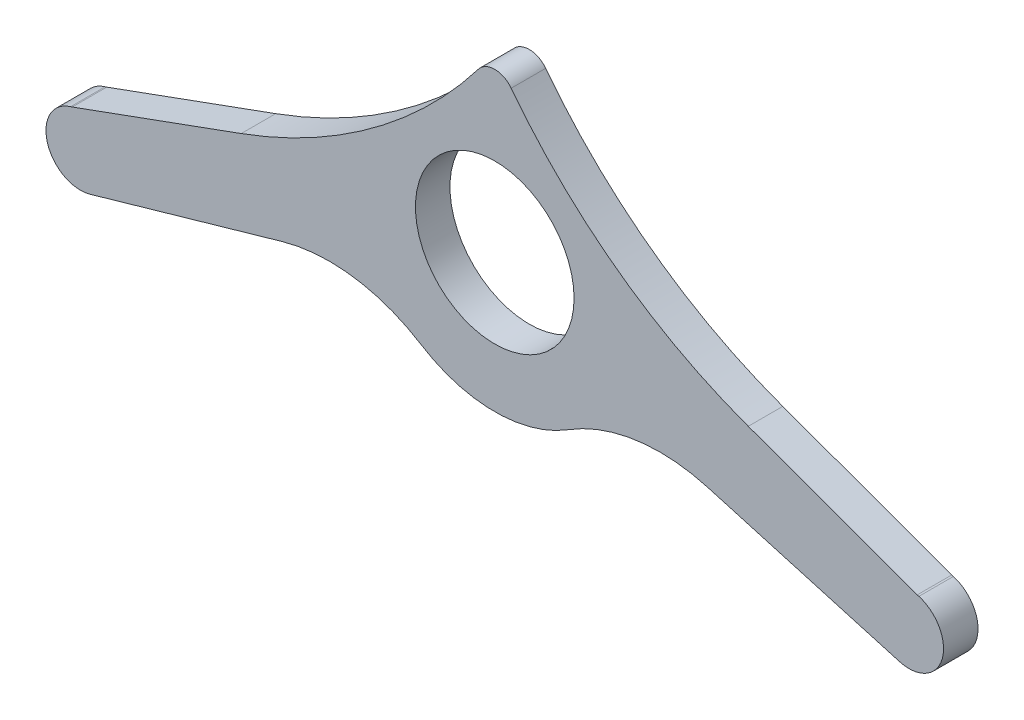
ISO-10303-21;
HEADER;
FILE_DESCRIPTION(('STEP AP214'),'2;1');
FILE_NAME('part.step','',(''),(''),'','','');
FILE_SCHEMA(('AUTOMOTIVE_DESIGN { 1 0 10303 214 1 1 1 1 }'));
ENDSEC;
DATA;
#1=APPLICATION_CONTEXT('core data for automotive mechanical design processes');
#2=APPLICATION_PROTOCOL_DEFINITION('international standard','automotive_design',2000,#1);
#3=PRODUCT_CONTEXT('',#1,'mechanical');
#4=PRODUCT('Part','Part','',(#3));
#5=PRODUCT_RELATED_PRODUCT_CATEGORY('part','',(#4));
#6=PRODUCT_DEFINITION_FORMATION('','',#4);
#7=PRODUCT_DEFINITION_CONTEXT('part definition',#1,'design');
#8=PRODUCT_DEFINITION('design','',#6,#7);
#9=PRODUCT_DEFINITION_SHAPE('','',#8);
#10=(LENGTH_UNIT() NAMED_UNIT(*) SI_UNIT(.MILLI.,.METRE.));
#11=(NAMED_UNIT(*) PLANE_ANGLE_UNIT() SI_UNIT($,.RADIAN.));
#12=(NAMED_UNIT(*) SI_UNIT($,.STERADIAN.) SOLID_ANGLE_UNIT());
#13=UNCERTAINTY_MEASURE_WITH_UNIT(LENGTH_MEASURE(1.E-05),#10,'distance_accuracy_value','');
#14=(GEOMETRIC_REPRESENTATION_CONTEXT(3) GLOBAL_UNCERTAINTY_ASSIGNED_CONTEXT((#13)) GLOBAL_UNIT_ASSIGNED_CONTEXT((#10,
#11,#12)) REPRESENTATION_CONTEXT('',''));
#15=CARTESIAN_POINT('',(0.,0.,0.));
#16=DIRECTION('',(0.,0.,1.));
#17=DIRECTION('',(1.,0.,0.));
#18=AXIS2_PLACEMENT_3D('',#15,#16,#17);
#19=CARTESIAN_POINT('',(0.,0.,5.));
#20=DIRECTION('',(0.,0.,-1.));
#21=DIRECTION('',(-1.,0.,0.));
#22=AXIS2_PLACEMENT_3D('',#19,#20,#21);
#23=CYLINDRICAL_SURFACE('',#22,11.5);
#24=CARTESIAN_POINT('',(0.,0.,5.));
#25=DIRECTION('',(0.,0.,1.));
#26=DIRECTION('',(1.,0.,0.));
#27=AXIS2_PLACEMENT_3D('',#24,#25,#26);
#28=CIRCLE('',#27,11.5);
#29=CARTESIAN_POINT('',(11.5,0.,5.));
#30=VERTEX_POINT('',#29);
#31=EDGE_CURVE('E220',#30,#30,#28,.T.);
#32=ORIENTED_EDGE('',*,*,#31,.T.);
#33=EDGE_LOOP('',(#32));
#34=FACE_BOUND('',#33,.T.);
#35=CARTESIAN_POINT('',(0.,0.,0.));
#36=DIRECTION('',(0.,0.,1.));
#37=DIRECTION('',(1.,0.,0.));
#38=AXIS2_PLACEMENT_3D('',#35,#36,#37);
#39=CIRCLE('',#38,11.5);
#40=CARTESIAN_POINT('',(11.5,0.,0.));
#41=VERTEX_POINT('',#40);
#42=EDGE_CURVE('E260',#41,#41,#39,.T.);
#43=ORIENTED_EDGE('',*,*,#42,.F.);
#44=EDGE_LOOP('',(#43));
#45=FACE_BOUND('',#44,.T.);
#46=ADVANCED_FACE('F86',(#34,#45),#23,.F.);
#47=CARTESIAN_POINT('',(62.7335795182697,67.9127360594033,5.));
#48=DIRECTION('',(0.,0.,-1.));
#49=DIRECTION('',(-1.,0.,0.));
#50=AXIS2_PLACEMENT_3D('',#47,#48,#49);
#51=CYLINDRICAL_SURFACE('',#50,75.9375213436114);
#52=CARTESIAN_POINT('',(62.7335795182697,67.9127360594033,0.));
#53=DIRECTION('',(0.,0.,1.));
#54=DIRECTION('',(1.,0.,0.));
#55=AXIS2_PLACEMENT_3D('',#52,#53,#54);
#56=CIRCLE('',#55,75.9375213436114);
#57=CARTESIAN_POINT('',(36.7614175845321,-3.44519238796093,0.));
#58=VERTEX_POINT('',#57);
#59=CARTESIAN_POINT('',(2.38417339880207,21.8209110918561,0.));
#60=VERTEX_POINT('',#59);
#61=EDGE_CURVE('E227',#58,#60,#56,.F.);
#62=ORIENTED_EDGE('',*,*,#61,.T.);
#63=DIRECTION('',(0.,0.,-1.));
#64=VECTOR('',#63,1.);
#65=CARTESIAN_POINT('',(2.38417339880207,21.8209110918561,5.));
#66=LINE('',#65,#64);
#67=CARTESIAN_POINT('',(2.38417339880207,21.8209110918561,5.));
#68=VERTEX_POINT('',#67);
#69=EDGE_CURVE('E98',#68,#60,#66,.T.);
#70=ORIENTED_EDGE('',*,*,#69,.F.);
#71=CARTESIAN_POINT('',(62.7335795182697,67.9127360594033,5.));
#72=DIRECTION('',(0.,0.,1.));
#73=DIRECTION('',(1.,0.,0.));
#74=AXIS2_PLACEMENT_3D('',#71,#72,#73);
#75=CIRCLE('',#74,75.9375213436114);
#76=CARTESIAN_POINT('',(36.7614175845321,-3.44519238796093,5.));
#77=VERTEX_POINT('',#76);
#78=EDGE_CURVE('E164',#77,#68,#75,.F.);
#79=ORIENTED_EDGE('',*,*,#78,.F.);
#80=DIRECTION('',(0.,0.,-1.));
#81=VECTOR('',#80,1.);
#82=CARTESIAN_POINT('',(36.7614175845321,-3.44519238796093,5.));
#83=LINE('',#82,#81);
#84=EDGE_CURVE('E12',#77,#58,#83,.T.);
#85=ORIENTED_EDGE('',*,*,#84,.T.);
#86=EDGE_LOOP('',(#62,#70,#79,#85));
#87=FACE_BOUND('',#86,.T.);
#88=ADVANCED_FACE('F344',(#87),#51,.F.);
#89=CARTESIAN_POINT('',(0.,20.,5.));
#90=DIRECTION('',(0.,0.,-1.));
#91=DIRECTION('',(-1.,0.,0.));
#92=AXIS2_PLACEMENT_3D('',#89,#90,#91);
#93=CYLINDRICAL_SURFACE('',#92,3.);
#94=CARTESIAN_POINT('',(0.,20.,0.));
#95=DIRECTION('',(0.,0.,1.));
#96=DIRECTION('',(1.,0.,0.));
#97=AXIS2_PLACEMENT_3D('',#94,#95,#96);
#98=CIRCLE('',#97,3.);
#99=CARTESIAN_POINT('',(-2.38417339880207,21.8209110918561,0.));
#100=VERTEX_POINT('',#99);
#101=EDGE_CURVE('E226',#60,#100,#98,.T.);
#102=ORIENTED_EDGE('',*,*,#101,.T.);
#103=DIRECTION('',(0.,0.,-1.));
#104=VECTOR('',#103,1.);
#105=CARTESIAN_POINT('',(-2.38417339880207,21.8209110918561,5.));
#106=LINE('',#105,#104);
#107=CARTESIAN_POINT('',(-2.38417339880207,21.8209110918561,5.));
#108=VERTEX_POINT('',#107);
#109=EDGE_CURVE('E278',#108,#100,#106,.T.);
#110=ORIENTED_EDGE('',*,*,#109,.F.);
#111=CARTESIAN_POINT('',(0.,20.,5.));
#112=DIRECTION('',(0.,0.,1.));
#113=DIRECTION('',(1.,0.,0.));
#114=AXIS2_PLACEMENT_3D('',#111,#112,#113);
#115=CIRCLE('',#114,3.);
#116=EDGE_CURVE('E290',#68,#108,#115,.T.);
#117=ORIENTED_EDGE('',*,*,#116,.F.);
#118=ORIENTED_EDGE('',*,*,#69,.T.);
#119=EDGE_LOOP('',(#102,#110,#117,#118));
#120=FACE_BOUND('',#119,.T.);
#121=ADVANCED_FACE('F289',(#120),#93,.T.);
#122=CARTESIAN_POINT('',(-62.7335795182697,67.9127360594033,5.));
#123=DIRECTION('',(0.,0.,-1.));
#124=DIRECTION('',(-1.,0.,0.));
#125=AXIS2_PLACEMENT_3D('',#122,#123,#124);
#126=CYLINDRICAL_SURFACE('',#125,75.9375213436114);
#127=CARTESIAN_POINT('',(-62.7335795182697,67.9127360594033,0.));
#128=DIRECTION('',(0.,0.,1.));
#129=DIRECTION('',(1.,0.,0.));
#130=AXIS2_PLACEMENT_3D('',#127,#128,#129);
#131=CIRCLE('',#130,75.9375213436114);
#132=CARTESIAN_POINT('',(-36.7614175845321,-3.44519238796093,0.));
#133=VERTEX_POINT('',#132);
#134=EDGE_CURVE('E235',#133,#100,#131,.T.);
#135=ORIENTED_EDGE('',*,*,#134,.F.);
#136=DIRECTION('',(0.,0.,-1.));
#137=VECTOR('',#136,1.);
#138=CARTESIAN_POINT('',(-36.7614175845321,-3.44519238796093,5.));
#139=LINE('',#138,#137);
#140=CARTESIAN_POINT('',(-36.7614175845321,-3.44519238796093,5.));
#141=VERTEX_POINT('',#140);
#142=EDGE_CURVE('E279',#141,#133,#139,.T.);
#143=ORIENTED_EDGE('',*,*,#142,.F.);
#144=CARTESIAN_POINT('',(-62.7335795182697,67.9127360594033,5.));
#145=DIRECTION('',(0.,0.,1.));
#146=DIRECTION('',(1.,0.,0.));
#147=AXIS2_PLACEMENT_3D('',#144,#145,#146);
#148=CIRCLE('',#147,75.9375213436114);
#149=EDGE_CURVE('E300',#141,#108,#148,.T.);
#150=ORIENTED_EDGE('',*,*,#149,.T.);
#151=ORIENTED_EDGE('',*,*,#109,.T.);
#152=EDGE_LOOP('',(#135,#143,#150,#151));
#153=FACE_BOUND('',#152,.T.);
#154=ADVANCED_FACE('F298',(#153),#126,.F.);
#155=CARTESIAN_POINT('',(-3.19300547137855,8.77271043280779,5.));
#156=DIRECTION('',(-0.342020143325663,0.93969262078591,0.));
#157=DIRECTION('',(-0.93969262078591,-0.342020143325663,0.));
#158=AXIS2_PLACEMENT_3D('',#155,#156,#157);
#159=PLANE('',#158);
#160=DIRECTION('',(0.939692620785911,0.342020143325663,0.));
#161=VECTOR('',#160,1.);
#162=CARTESIAN_POINT('',(-3.19300547137855,8.77271043280779,0.));
#163=LINE('',#162,#161);
#164=CARTESIAN_POINT('',(-61.2649014678834,-12.3637311573222,0.));
#165=VERTEX_POINT('',#164);
#166=EDGE_CURVE('E237',#165,#133,#163,.T.);
#167=ORIENTED_EDGE('',*,*,#166,.F.);
#168=DIRECTION('',(0.,0.,-1.));
#169=VECTOR('',#168,1.);
#170=CARTESIAN_POINT('',(-61.2649014678834,-12.3637311573222,5.));
#171=LINE('',#170,#169);
#172=CARTESIAN_POINT('',(-61.2649014678834,-12.3637311573222,5.));
#173=VERTEX_POINT('',#172);
#174=EDGE_CURVE('E277',#173,#165,#171,.T.);
#175=ORIENTED_EDGE('',*,*,#174,.F.);
#176=DIRECTION('',(0.939692620785911,0.342020143325663,0.));
#177=VECTOR('',#176,1.);
#178=CARTESIAN_POINT('',(-3.19300547137855,8.77271043280779,5.));
#179=LINE('',#178,#177);
#180=EDGE_CURVE('E301',#173,#141,#179,.T.);
#181=ORIENTED_EDGE('',*,*,#180,.T.);
#182=ORIENTED_EDGE('',*,*,#142,.T.);
#183=EDGE_LOOP('',(#167,#175,#181,#182));
#184=FACE_BOUND('',#183,.T.);
#185=ADVANCED_FACE('F512',(#184),#159,.T.);
#186=CARTESIAN_POINT('',(-1.59135260480715,5.35837356331416,5.));
#187=DIRECTION('',(-0.284694541752313,0.958618285813723,0.));
#188=DIRECTION('',(-0.958618285813723,-0.284694541752313,0.));
#189=AXIS2_PLACEMENT_3D('',#186,#187,#188);
#190=PLANE('',#189);
#191=DIRECTION('',(0.958618285813723,0.284694541752313,0.));
#192=VECTOR('',#191,1.);
#193=CARTESIAN_POINT('',(-1.59135260480715,5.35837356331416,0.));
#194=LINE('',#193,#192);
#195=CARTESIAN_POINT('',(-61.5023287049065,-12.4342433094939,0.));
#196=VERTEX_POINT('',#195);
#197=EDGE_CURVE('E239',#196,#165,#194,.T.);
#198=ORIENTED_EDGE('',*,*,#197,.F.);
#199=DIRECTION('',(0.,0.,-1.));
#200=VECTOR('',#199,1.);
#201=CARTESIAN_POINT('',(-61.5023287049065,-12.4342433094939,5.));
#202=LINE('',#201,#200);
#203=CARTESIAN_POINT('',(-61.5023287049065,-12.4342433094939,5.));
#204=VERTEX_POINT('',#203);
#205=EDGE_CURVE('E273',#204,#196,#202,.T.);
#206=ORIENTED_EDGE('',*,*,#205,.F.);
#207=DIRECTION('',(0.958618285813723,0.284694541752313,0.));
#208=VECTOR('',#207,1.);
#209=CARTESIAN_POINT('',(-1.59135260480715,5.35837356331416,5.));
#210=LINE('',#209,#208);
#211=EDGE_CURVE('E303',#204,#173,#210,.T.);
#212=ORIENTED_EDGE('',*,*,#211,.T.);
#213=ORIENTED_EDGE('',*,*,#174,.T.);
#214=EDGE_LOOP('',(#198,#206,#212,#213));
#215=FACE_BOUND('',#214,.T.);
#216=ADVANCED_FACE('F504',(#215),#190,.T.);
#217=CARTESIAN_POINT('',(-60.0788559961449,-17.2273347385625,5.));
#218=DIRECTION('',(0.,0.,-1.));
#219=DIRECTION('',(-1.,0.,0.));
#220=AXIS2_PLACEMENT_3D('',#217,#218,#219);
#221=CYLINDRICAL_SURFACE('',#220,5.);
#222=CARTESIAN_POINT('',(-60.0788559961449,-17.2273347385625,0.));
#223=DIRECTION('',(0.,0.,1.));
#224=DIRECTION('',(1.,0.,0.));
#225=AXIS2_PLACEMENT_3D('',#222,#223,#224);
#226=CIRCLE('',#225,5.);
#227=CARTESIAN_POINT('',(-58.7006692170599,-22.0336432182541,0.));
#228=VERTEX_POINT('',#227);
#229=EDGE_CURVE('E244',#228,#196,#226,.F.);
#230=ORIENTED_EDGE('',*,*,#229,.F.);
#231=DIRECTION('',(0.,0.,-1.));
#232=VECTOR('',#231,1.);
#233=CARTESIAN_POINT('',(-58.7006692170599,-22.0336432182541,5.));
#234=LINE('',#233,#232);
#235=CARTESIAN_POINT('',(-58.7006692170599,-22.0336432182541,5.));
#236=VERTEX_POINT('',#235);
#237=EDGE_CURVE('E275',#236,#228,#234,.T.);
#238=ORIENTED_EDGE('',*,*,#237,.F.);
#239=CARTESIAN_POINT('',(-60.0788559961449,-17.2273347385625,5.));
#240=DIRECTION('',(0.,0.,1.));
#241=DIRECTION('',(1.,0.,0.));
#242=AXIS2_PLACEMENT_3D('',#239,#240,#241);
#243=CIRCLE('',#242,5.);
#244=EDGE_CURVE('E313',#236,#204,#243,.F.);
#245=ORIENTED_EDGE('',*,*,#244,.T.);
#246=ORIENTED_EDGE('',*,*,#205,.T.);
#247=EDGE_LOOP('',(#230,#238,#245,#246));
#248=FACE_BOUND('',#247,.T.);
#249=ADVANCED_FACE('F495',(#248),#221,.T.);
#250=CARTESIAN_POINT('',(1.37818677908509,-4.80630847969204,5.));
#251=DIRECTION('',(-0.275637355816993,0.961261695938321,0.));
#252=DIRECTION('',(-0.961261695938321,-0.275637355816993,0.));
#253=AXIS2_PLACEMENT_3D('',#250,#251,#252);
#254=PLANE('',#253);
#255=DIRECTION('',(0.961261695938321,0.275637355816993,0.));
#256=VECTOR('',#255,1.);
#257=CARTESIAN_POINT('',(1.37818677908509,-4.80630847969204,0.));
#258=LINE('',#257,#256);
#259=CARTESIAN_POINT('',(-30.8635106651872,-14.0514664508682,0.));
#260=VERTEX_POINT('',#259);
#261=EDGE_CURVE('E241',#228,#260,#258,.T.);
#262=ORIENTED_EDGE('',*,*,#261,.T.);
#263=DIRECTION('',(0.,0.,-1.));
#264=VECTOR('',#263,1.);
#265=CARTESIAN_POINT('',(-30.8635106651872,-14.0514664508682,5.));
#266=LINE('',#265,#264);
#267=CARTESIAN_POINT('',(-30.8635106651872,-14.0514664508682,5.));
#268=VERTEX_POINT('',#267);
#269=EDGE_CURVE('E267',#268,#260,#266,.T.);
#270=ORIENTED_EDGE('',*,*,#269,.F.);
#271=DIRECTION('',(0.961261695938321,0.275637355816993,0.));
#272=VECTOR('',#271,1.);
#273=CARTESIAN_POINT('',(1.37818677908509,-4.80630847969204,5.));
#274=LINE('',#273,#272);
#275=EDGE_CURVE('E314',#236,#268,#274,.T.);
#276=ORIENTED_EDGE('',*,*,#275,.F.);
#277=ORIENTED_EDGE('',*,*,#237,.T.);
#278=EDGE_LOOP('',(#262,#270,#276,#277));
#279=FACE_BOUND('',#278,.T.);
#280=ADVANCED_FACE('F485',(#279),#254,.F.);
#281=CARTESIAN_POINT('',(-23.9725767697622,-38.0830088493262,5.));
#282=DIRECTION('',(0.,0.,-1.));
#283=DIRECTION('',(-1.,0.,0.));
#284=AXIS2_PLACEMENT_3D('',#281,#282,#283);
#285=CYLINDRICAL_SURFACE('',#284,25.);
#286=CARTESIAN_POINT('',(-23.9725767697622,-38.0830088493262,0.));
#287=DIRECTION('',(0.,0.,1.));
#288=DIRECTION('',(1.,0.,0.));
#289=AXIS2_PLACEMENT_3D('',#286,#287,#288);
#290=CIRCLE('',#289,25.);
#291=CARTESIAN_POINT('',(-10.6544785643388,-16.9257817108117,0.));
#292=VERTEX_POINT('',#291);
#293=EDGE_CURVE('E246',#260,#292,#290,.F.);
#294=ORIENTED_EDGE('',*,*,#293,.T.);
#295=DIRECTION('',(0.,0.,-1.));
#296=VECTOR('',#295,1.);
#297=CARTESIAN_POINT('',(-10.6544785643388,-16.9257817108117,5.));
#298=LINE('',#297,#296);
#299=CARTESIAN_POINT('',(-10.6544785643388,-16.9257817108117,5.));
#300=VERTEX_POINT('',#299);
#301=EDGE_CURVE('E266',#300,#292,#298,.T.);
#302=ORIENTED_EDGE('',*,*,#301,.F.);
#303=CARTESIAN_POINT('',(-23.9725767697622,-38.0830088493262,5.));
#304=DIRECTION('',(0.,0.,1.));
#305=DIRECTION('',(1.,0.,0.));
#306=AXIS2_PLACEMENT_3D('',#303,#304,#305);
#307=CIRCLE('',#306,25.);
#308=EDGE_CURVE('E316',#268,#300,#307,.F.);
#309=ORIENTED_EDGE('',*,*,#308,.F.);
#310=ORIENTED_EDGE('',*,*,#269,.T.);
#311=EDGE_LOOP('',(#294,#302,#309,#310));
#312=FACE_BOUND('',#311,.T.);
#313=ADVANCED_FACE('F471',(#312),#285,.F.);
#314=CARTESIAN_POINT('',(0.,0.,5.));
#315=DIRECTION('',(0.,0.,-1.));
#316=DIRECTION('',(-1.,0.,0.));
#317=AXIS2_PLACEMENT_3D('',#314,#315,#316);
#318=CYLINDRICAL_SURFACE('',#317,20.);
#319=CARTESIAN_POINT('',(0.,0.,0.));
#320=DIRECTION('',(0.,0.,1.));
#321=DIRECTION('',(1.,0.,0.));
#322=AXIS2_PLACEMENT_3D('',#319,#320,#321);
#323=CIRCLE('',#322,20.);
#324=CARTESIAN_POINT('',(10.6544785643388,-16.9257817108117,0.));
#325=VERTEX_POINT('',#324);
#326=EDGE_CURVE('E248',#292,#325,#323,.T.);
#327=ORIENTED_EDGE('',*,*,#326,.T.);
#328=DIRECTION('',(0.,0.,-1.));
#329=VECTOR('',#328,1.);
#330=CARTESIAN_POINT('',(10.6544785643388,-16.9257817108117,5.));
#331=LINE('',#330,#329);
#332=CARTESIAN_POINT('',(10.6544785643388,-16.9257817108117,5.));
#333=VERTEX_POINT('',#332);
#334=EDGE_CURVE('E262',#333,#325,#331,.T.);
#335=ORIENTED_EDGE('',*,*,#334,.F.);
#336=CARTESIAN_POINT('',(0.,0.,5.));
#337=DIRECTION('',(0.,0.,1.));
#338=DIRECTION('',(1.,0.,0.));
#339=AXIS2_PLACEMENT_3D('',#336,#337,#338);
#340=CIRCLE('',#339,20.);
#341=EDGE_CURVE('E218',#300,#333,#340,.T.);
#342=ORIENTED_EDGE('',*,*,#341,.F.);
#343=ORIENTED_EDGE('',*,*,#301,.T.);
#344=EDGE_LOOP('',(#327,#335,#342,#343));
#345=FACE_BOUND('',#344,.T.);
#346=ADVANCED_FACE('F325',(#345),#318,.T.);
#347=CARTESIAN_POINT('',(23.9725767697622,-38.0830088493262,5.));
#348=DIRECTION('',(0.,0.,-1.));
#349=DIRECTION('',(-1.,0.,0.));
#350=AXIS2_PLACEMENT_3D('',#347,#348,#349);
#351=CYLINDRICAL_SURFACE('',#350,25.);
#352=CARTESIAN_POINT('',(23.9725767697622,-38.0830088493262,0.));
#353=DIRECTION('',(0.,0.,1.));
#354=DIRECTION('',(1.,0.,0.));
#355=AXIS2_PLACEMENT_3D('',#352,#353,#354);
#356=CIRCLE('',#355,25.);
#357=CARTESIAN_POINT('',(30.8635106651872,-14.0514664508682,0.));
#358=VERTEX_POINT('',#357);
#359=EDGE_CURVE('E252',#358,#325,#356,.T.);
#360=ORIENTED_EDGE('',*,*,#359,.F.);
#361=DIRECTION('',(0.,0.,-1.));
#362=VECTOR('',#361,1.);
#363=CARTESIAN_POINT('',(30.8635106651872,-14.0514664508682,5.));
#364=LINE('',#363,#362);
#365=CARTESIAN_POINT('',(30.8635106651872,-14.0514664508682,5.));
#366=VERTEX_POINT('',#365);
#367=EDGE_CURVE('E210',#366,#358,#364,.T.);
#368=ORIENTED_EDGE('',*,*,#367,.F.);
#369=CARTESIAN_POINT('',(23.9725767697622,-38.0830088493262,5.));
#370=DIRECTION('',(0.,0.,1.));
#371=DIRECTION('',(1.,0.,0.));
#372=AXIS2_PLACEMENT_3D('',#369,#370,#371);
#373=CIRCLE('',#372,25.);
#374=EDGE_CURVE('E214',#366,#333,#373,.T.);
#375=ORIENTED_EDGE('',*,*,#374,.T.);
#376=ORIENTED_EDGE('',*,*,#334,.T.);
#377=EDGE_LOOP('',(#360,#368,#375,#376));
#378=FACE_BOUND('',#377,.T.);
#379=ADVANCED_FACE('F326',(#378),#351,.F.);
#380=CARTESIAN_POINT('',(-1.378186779085,-4.8063084796916,5.));
#381=DIRECTION('',(-0.275637355817,-0.961261695938319,0.));
#382=DIRECTION('',(0.961261695938319,-0.275637355817,0.));
#383=AXIS2_PLACEMENT_3D('',#380,#381,#382);
#384=PLANE('',#383);
#385=DIRECTION('',(-0.961261695938319,0.275637355817,0.));
#386=VECTOR('',#385,1.);
#387=CARTESIAN_POINT('',(-1.378186779085,-4.8063084796916,0.));
#388=LINE('',#387,#386);
#389=CARTESIAN_POINT('',(58.7006692170599,-22.0336432182541,0.));
#390=VERTEX_POINT('',#389);
#391=EDGE_CURVE('E204',#390,#358,#388,.T.);
#392=ORIENTED_EDGE('',*,*,#391,.F.);
#393=DIRECTION('',(0.,0.,-1.));
#394=VECTOR('',#393,1.);
#395=CARTESIAN_POINT('',(58.7006692170599,-22.0336432182541,5.));
#396=LINE('',#395,#394);
#397=CARTESIAN_POINT('',(58.7006692170599,-22.0336432182541,5.));
#398=VERTEX_POINT('',#397);
#399=EDGE_CURVE('E196',#398,#390,#396,.T.);
#400=ORIENTED_EDGE('',*,*,#399,.F.);
#401=DIRECTION('',(-0.961261695938319,0.275637355817,0.));
#402=VECTOR('',#401,1.);
#403=CARTESIAN_POINT('',(-1.378186779085,-4.8063084796916,5.));
#404=LINE('',#403,#402);
#405=EDGE_CURVE('E205',#398,#366,#404,.T.);
#406=ORIENTED_EDGE('',*,*,#405,.T.);
#407=ORIENTED_EDGE('',*,*,#367,.T.);
#408=EDGE_LOOP('',(#392,#400,#406,#407));
#409=FACE_BOUND('',#408,.T.);
#410=ADVANCED_FACE('F199',(#409),#384,.T.);
#411=CARTESIAN_POINT('',(1.59135260480715,5.35837356331416,5.));
#412=DIRECTION('',(-0.284694541752313,-0.958618285813723,0.));
#413=DIRECTION('',(0.958618285813723,-0.284694541752313,0.));
#414=AXIS2_PLACEMENT_3D('',#411,#412,#413);
#415=PLANE('',#414);
#416=DIRECTION('',(-0.958618285813723,0.284694541752313,0.));
#417=VECTOR('',#416,1.);
#418=CARTESIAN_POINT('',(1.59135260480715,5.35837356331416,0.));
#419=LINE('',#418,#417);
#420=CARTESIAN_POINT('',(61.5023287049065,-12.4342433094939,0.));
#421=VERTEX_POINT('',#420);
#422=CARTESIAN_POINT('',(61.2649014678834,-12.3637311573222,0.));
#423=VERTEX_POINT('',#422);
#424=EDGE_CURVE('E160',#421,#423,#419,.T.);
#425=ORIENTED_EDGE('',*,*,#424,.T.);
#426=DIRECTION('',(0.,0.,-1.));
#427=VECTOR('',#426,1.);
#428=CARTESIAN_POINT('',(61.2649014678834,-12.3637311573222,5.));
#429=LINE('',#428,#427);
#430=CARTESIAN_POINT('',(61.2649014678834,-12.3637311573222,5.));
#431=VERTEX_POINT('',#430);
#432=EDGE_CURVE('E223',#431,#423,#429,.T.);
#433=ORIENTED_EDGE('',*,*,#432,.F.);
#434=DIRECTION('',(-0.958618285813723,0.284694541752313,0.));
#435=VECTOR('',#434,1.);
#436=CARTESIAN_POINT('',(1.59135260480715,5.35837356331416,5.));
#437=LINE('',#436,#435);
#438=CARTESIAN_POINT('',(61.5023287049065,-12.4342433094939,5.));
#439=VERTEX_POINT('',#438);
#440=EDGE_CURVE('E110',#439,#431,#437,.T.);
#441=ORIENTED_EDGE('',*,*,#440,.F.);
#442=DIRECTION('',(0.,0.,-1.));
#443=VECTOR('',#442,1.);
#444=CARTESIAN_POINT('',(61.5023287049065,-12.4342433094939,5.));
#445=LINE('',#444,#443);
#446=EDGE_CURVE('E153',#439,#421,#445,.T.);
#447=ORIENTED_EDGE('',*,*,#446,.T.);
#448=EDGE_LOOP('',(#425,#433,#441,#447));
#449=FACE_BOUND('',#448,.T.);
#450=ADVANCED_FACE('F332',(#449),#415,.F.);
#451=CARTESIAN_POINT('',(3.19300547137855,8.77271043280779,5.));
#452=DIRECTION('',(-0.342020143325663,-0.93969262078591,0.));
#453=DIRECTION('',(0.93969262078591,-0.342020143325663,0.));
#454=AXIS2_PLACEMENT_3D('',#451,#452,#453);
#455=PLANE('',#454);
#456=DIRECTION('',(-0.939692620785911,0.342020143325663,0.));
#457=VECTOR('',#456,1.);
#458=CARTESIAN_POINT('',(3.19300547137855,8.77271043280779,0.));
#459=LINE('',#458,#457);
#460=EDGE_CURVE('E209',#423,#58,#459,.T.);
#461=ORIENTED_EDGE('',*,*,#460,.T.);
#462=ORIENTED_EDGE('',*,*,#84,.F.);
#463=DIRECTION('',(-0.939692620785911,0.342020143325663,0.));
#464=VECTOR('',#463,1.);
#465=CARTESIAN_POINT('',(3.19300547137855,8.77271043280779,5.));
#466=LINE('',#465,#464);
#467=EDGE_CURVE('E257',#431,#77,#466,.T.);
#468=ORIENTED_EDGE('',*,*,#467,.F.);
#469=ORIENTED_EDGE('',*,*,#432,.T.);
#470=EDGE_LOOP('',(#461,#462,#468,#469));
#471=FACE_BOUND('',#470,.T.);
#472=ADVANCED_FACE('F328',(#471),#455,.F.);
#473=CARTESIAN_POINT('',(0.,0.,0.));
#474=DIRECTION('',(0.,0.,1.));
#475=DIRECTION('',(1.,0.,0.));
#476=AXIS2_PLACEMENT_3D('',#473,#474,#475);
#477=PLANE('',#476);
#478=ORIENTED_EDGE('',*,*,#460,.F.);
#479=ORIENTED_EDGE('',*,*,#424,.F.);
#480=CARTESIAN_POINT('',(60.0788559961449,-17.2273347385625,0.));
#481=DIRECTION('',(0.,0.,1.));
#482=DIRECTION('',(1.,0.,0.));
#483=AXIS2_PLACEMENT_3D('',#480,#481,#482);
#484=CIRCLE('',#483,5.);
#485=EDGE_CURVE('E95',#390,#421,#484,.T.);
#486=ORIENTED_EDGE('',*,*,#485,.F.);
#487=ORIENTED_EDGE('',*,*,#391,.T.);
#488=ORIENTED_EDGE('',*,*,#359,.T.);
#489=ORIENTED_EDGE('',*,*,#326,.F.);
#490=ORIENTED_EDGE('',*,*,#293,.F.);
#491=ORIENTED_EDGE('',*,*,#261,.F.);
#492=ORIENTED_EDGE('',*,*,#229,.T.);
#493=ORIENTED_EDGE('',*,*,#197,.T.);
#494=ORIENTED_EDGE('',*,*,#166,.T.);
#495=ORIENTED_EDGE('',*,*,#134,.T.);
#496=ORIENTED_EDGE('',*,*,#101,.F.);
#497=ORIENTED_EDGE('',*,*,#61,.F.);
#498=EDGE_LOOP('',(#478,#479,#486,#487,#488,#489,#490,#491,#492,#493,#494,#495,#496,#497));
#499=FACE_BOUND('',#498,.T.);
#500=ORIENTED_EDGE('',*,*,#42,.T.);
#501=EDGE_LOOP('',(#500));
#502=FACE_BOUND('',#501,.T.);
#503=ADVANCED_FACE('F292',(#499,#502),#477,.F.);
#504=CARTESIAN_POINT('',(0.,0.,5.));
#505=DIRECTION('',(0.,0.,1.));
#506=DIRECTION('',(1.,0.,0.));
#507=AXIS2_PLACEMENT_3D('',#504,#505,#506);
#508=PLANE('',#507);
#509=ORIENTED_EDGE('',*,*,#467,.T.);
#510=ORIENTED_EDGE('',*,*,#78,.T.);
#511=ORIENTED_EDGE('',*,*,#116,.T.);
#512=ORIENTED_EDGE('',*,*,#149,.F.);
#513=ORIENTED_EDGE('',*,*,#180,.F.);
#514=ORIENTED_EDGE('',*,*,#211,.F.);
#515=ORIENTED_EDGE('',*,*,#244,.F.);
#516=ORIENTED_EDGE('',*,*,#275,.T.);
#517=ORIENTED_EDGE('',*,*,#308,.T.);
#518=ORIENTED_EDGE('',*,*,#341,.T.);
#519=ORIENTED_EDGE('',*,*,#374,.F.);
#520=ORIENTED_EDGE('',*,*,#405,.F.);
#521=CARTESIAN_POINT('',(60.0788559961449,-17.2273347385625,5.));
#522=DIRECTION('',(0.,0.,1.));
#523=DIRECTION('',(1.,0.,0.));
#524=AXIS2_PLACEMENT_3D('',#521,#522,#523);
#525=CIRCLE('',#524,5.);
#526=EDGE_CURVE('E207',#398,#439,#525,.T.);
#527=ORIENTED_EDGE('',*,*,#526,.T.);
#528=ORIENTED_EDGE('',*,*,#440,.T.);
#529=EDGE_LOOP('',(#509,#510,#511,#512,#513,#514,#515,#516,#517,#518,#519,#520,#527,#528));
#530=FACE_BOUND('',#529,.T.);
#531=ORIENTED_EDGE('',*,*,#31,.F.);
#532=EDGE_LOOP('',(#531));
#533=FACE_BOUND('',#532,.T.);
#534=ADVANCED_FACE('F215',(#530,#533),#508,.T.);
#535=CARTESIAN_POINT('',(60.0788559961449,-17.2273347385625,5.));
#536=DIRECTION('',(0.,0.,-1.));
#537=DIRECTION('',(-1.,0.,0.));
#538=AXIS2_PLACEMENT_3D('',#535,#536,#537);
#539=CYLINDRICAL_SURFACE('',#538,5.);
#540=ORIENTED_EDGE('',*,*,#399,.T.);
#541=ORIENTED_EDGE('',*,*,#485,.T.);
#542=ORIENTED_EDGE('',*,*,#446,.F.);
#543=ORIENTED_EDGE('',*,*,#526,.F.);
#544=EDGE_LOOP('',(#540,#541,#542,#543));
#545=FACE_BOUND('',#544,.T.);
#546=ADVANCED_FACE('F89',(#545),#539,.T.);
#547=CLOSED_SHELL('',(#46,#88,#121,#154,#185,#216,#249,#280,#313,#346,#379,#410,#450,#472,#503,
#534,#546));
#548=MANIFOLD_SOLID_BREP('B2',#547);
#549=ADVANCED_BREP_SHAPE_REPRESENTATION('',(#18,#548),#14);
#550=SHAPE_DEFINITION_REPRESENTATION(#9,#549);
ENDSEC;
END-ISO-10303-21;
